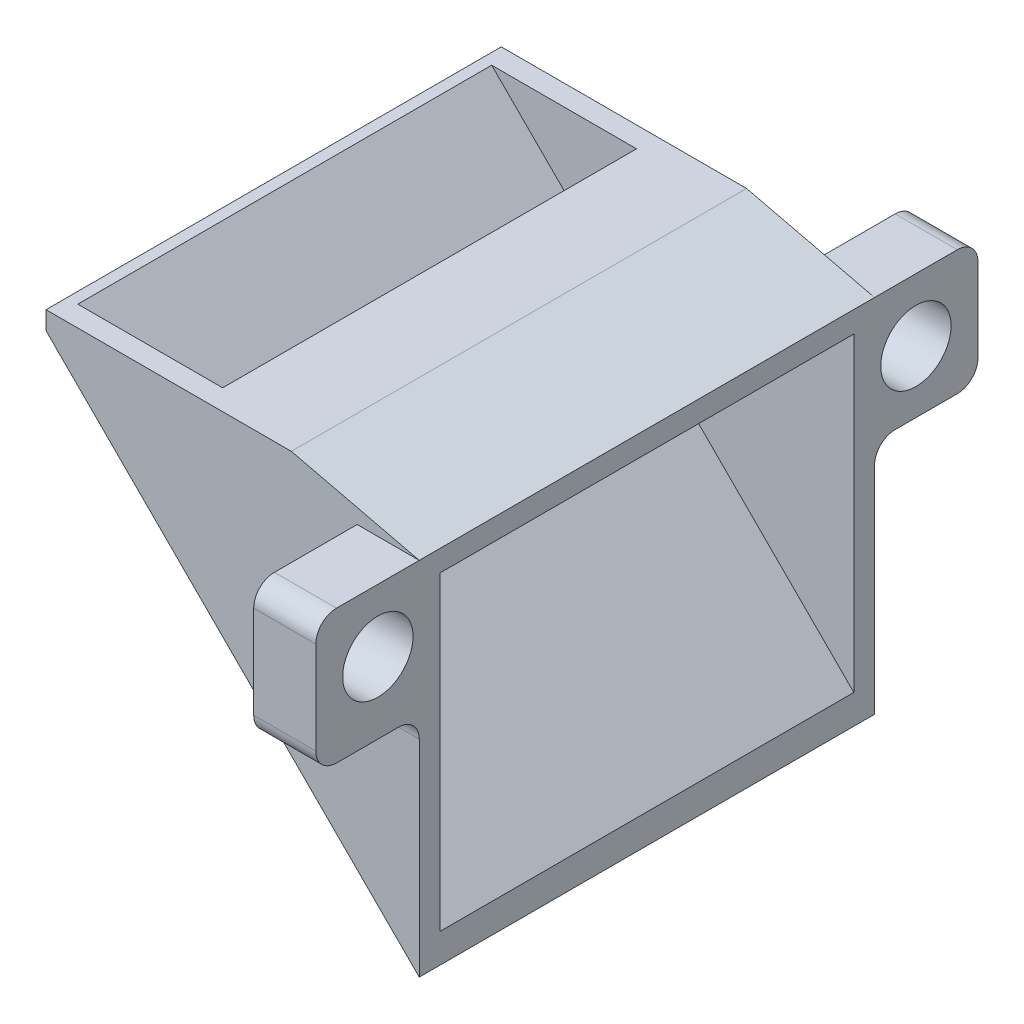
ISO-10303-21;
HEADER;
FILE_DESCRIPTION(('STEP AP214'),'2;1');
FILE_NAME('part.step','',(''),(''),'','','');
FILE_SCHEMA(('AUTOMOTIVE_DESIGN { 1 0 10303 214 1 1 1 1 }'));
ENDSEC;
DATA;
#1=APPLICATION_CONTEXT('core data for automotive mechanical design processes');
#2=APPLICATION_PROTOCOL_DEFINITION('international standard','automotive_design',2000,#1);
#3=PRODUCT_CONTEXT('',#1,'mechanical');
#4=PRODUCT('Part','Part','',(#3));
#5=PRODUCT_RELATED_PRODUCT_CATEGORY('part','',(#4));
#6=PRODUCT_DEFINITION_FORMATION('','',#4);
#7=PRODUCT_DEFINITION_CONTEXT('part definition',#1,'design');
#8=PRODUCT_DEFINITION('design','',#6,#7);
#9=PRODUCT_DEFINITION_SHAPE('','',#8);
#10=(LENGTH_UNIT() NAMED_UNIT(*) SI_UNIT(.MILLI.,.METRE.));
#11=(NAMED_UNIT(*) PLANE_ANGLE_UNIT() SI_UNIT($,.RADIAN.));
#12=(NAMED_UNIT(*) SI_UNIT($,.STERADIAN.) SOLID_ANGLE_UNIT());
#13=UNCERTAINTY_MEASURE_WITH_UNIT(LENGTH_MEASURE(1.E-05),#10,'distance_accuracy_value','');
#14=(GEOMETRIC_REPRESENTATION_CONTEXT(3) GLOBAL_UNCERTAINTY_ASSIGNED_CONTEXT((#13)) GLOBAL_UNIT_ASSIGNED_CONTEXT((#10,
#11,#12)) REPRESENTATION_CONTEXT('',''));
#15=CARTESIAN_POINT('',(0.,0.,0.));
#16=DIRECTION('',(0.,0.,1.));
#17=DIRECTION('',(1.,0.,0.));
#18=AXIS2_PLACEMENT_3D('',#15,#16,#17);
#19=CARTESIAN_POINT('',(0.,0.,-11.));
#20=DIRECTION('',(0.,0.,1.));
#21=DIRECTION('',(0.,-1.,0.));
#22=AXIS2_PLACEMENT_3D('',#19,#20,#21);
#23=PLANE('',#22);
#24=DIRECTION('',(-0.707106781186548,0.707106781186548,0.));
#25=VECTOR('',#24,1.);
#26=CARTESIAN_POINT('',(-4.45710678118655,-4.45710678118655,-11.));
#27=LINE('',#26,#25);
#28=CARTESIAN_POINT('',(10.,-18.9142135623731,-11.));
#29=VERTEX_POINT('',#28);
#30=CARTESIAN_POINT('',(-8.03645980155387,-0.877753760819228,-11.));
#31=VERTEX_POINT('',#30);
#32=EDGE_CURVE('E203',#29,#31,#27,.T.);
#33=ORIENTED_EDGE('',*,*,#32,.T.);
#34=DIRECTION('',(0.,-1.,0.));
#35=VECTOR('',#34,1.);
#36=CARTESIAN_POINT('',(-8.03645980155387,0.,-11.));
#37=LINE('',#36,#35);
#38=CARTESIAN_POINT('',(-8.03645980155387,0.,-11.));
#39=VERTEX_POINT('',#38);
#40=EDGE_CURVE('E56',#39,#31,#37,.T.);
#41=ORIENTED_EDGE('',*,*,#40,.F.);
#42=DIRECTION('',(-1.,0.,0.));
#43=VECTOR('',#42,1.);
#44=CARTESIAN_POINT('',(0.,0.,-11.));
#45=LINE('',#44,#43);
#46=CARTESIAN_POINT('',(3.81740662898458,0.,-11.));
#47=VERTEX_POINT('',#46);
#48=EDGE_CURVE('E199',#47,#39,#45,.T.);
#49=ORIENTED_EDGE('',*,*,#48,.F.);
#50=DIRECTION('',(-0.972806214685367,0.23162052730604,0.));
#51=VECTOR('',#50,1.);
#52=CARTESIAN_POINT('',(0.204796492971276,0.860145270479358,-11.));
#53=LINE('',#52,#51);
#54=CARTESIAN_POINT('',(10.,-1.47204604071795,-11.));
#55=VERTEX_POINT('',#54);
#56=EDGE_CURVE('E302',#55,#47,#53,.T.);
#57=ORIENTED_EDGE('',*,*,#56,.F.);
#58=DIRECTION('',(1.,0.,0.));
#59=VECTOR('',#58,1.);
#60=CARTESIAN_POINT('',(7.,-1.47204604071795,-11.));
#61=LINE('',#60,#59);
#62=CARTESIAN_POINT('',(7.,-1.47204604071795,-11.));
#63=VERTEX_POINT('',#62);
#64=EDGE_CURVE('E310',#63,#55,#61,.T.);
#65=ORIENTED_EDGE('',*,*,#64,.F.);
#66=DIRECTION('',(0.,-1.,0.));
#67=VECTOR('',#66,1.);
#68=CARTESIAN_POINT('',(7.,-1.47204604071795,-11.));
#69=LINE('',#68,#67);
#70=CARTESIAN_POINT('',(7.,-8.5,-11.));
#71=VERTEX_POINT('',#70);
#72=EDGE_CURVE('E313',#63,#71,#69,.T.);
#73=ORIENTED_EDGE('',*,*,#72,.T.);
#74=DIRECTION('',(1.,0.,0.));
#75=VECTOR('',#74,1.);
#76=CARTESIAN_POINT('',(0.,-8.5,-11.));
#77=LINE('',#76,#75);
#78=CARTESIAN_POINT('',(10.,-8.5,-11.));
#79=VERTEX_POINT('',#78);
#80=EDGE_CURVE('E434',#71,#79,#77,.T.);
#81=ORIENTED_EDGE('',*,*,#80,.T.);
#82=DIRECTION('',(0.,1.,0.));
#83=VECTOR('',#82,1.);
#84=CARTESIAN_POINT('',(10.,0.,-11.));
#85=LINE('',#84,#83);
#86=EDGE_CURVE('E222',#29,#79,#85,.T.);
#87=ORIENTED_EDGE('',*,*,#86,.F.);
#88=EDGE_LOOP('',(#33,#41,#49,#57,#65,#73,#81,#87));
#89=FACE_BOUND('',#88,.T.);
#90=ADVANCED_FACE('F41',(#89),#23,.F.);
#91=CARTESIAN_POINT('',(0.,0.,0.));
#92=DIRECTION('',(0.,-1.,0.));
#93=DIRECTION('',(0.,0.,-1.));
#94=AXIS2_PLACEMENT_3D('',#91,#92,#93);
#95=PLANE('',#94);
#96=ORIENTED_EDGE('',*,*,#48,.T.);
#97=DIRECTION('',(0.,0.,-1.));
#98=VECTOR('',#97,1.);
#99=CARTESIAN_POINT('',(-8.03645980155387,0.,16.));
#100=LINE('',#99,#98);
#101=CARTESIAN_POINT('',(-8.03645980155387,0.,11.));
#102=VERTEX_POINT('',#101);
#103=EDGE_CURVE('E188',#102,#39,#100,.T.);
#104=ORIENTED_EDGE('',*,*,#103,.F.);
#105=DIRECTION('',(1.,0.,0.));
#106=VECTOR('',#105,1.);
#107=CARTESIAN_POINT('',(0.,0.,11.));
#108=LINE('',#107,#106);
#109=CARTESIAN_POINT('',(3.81740662898458,0.,11.));
#110=VERTEX_POINT('',#109);
#111=EDGE_CURVE('E210',#102,#110,#108,.T.);
#112=ORIENTED_EDGE('',*,*,#111,.T.);
#113=DIRECTION('',(0.,0.,-1.));
#114=VECTOR('',#113,1.);
#115=CARTESIAN_POINT('',(3.81740662898458,0.,0.));
#116=LINE('',#115,#114);
#117=EDGE_CURVE('E209',#110,#47,#116,.T.);
#118=ORIENTED_EDGE('',*,*,#117,.T.);
#119=EDGE_LOOP('',(#96,#104,#112,#118));
#120=FACE_BOUND('',#119,.T.);
#121=DIRECTION('',(0.,0.,-1.));
#122=VECTOR('',#121,1.);
#123=CARTESIAN_POINT('',(-0.5,0.,10.));
#124=LINE('',#123,#122);
#125=CARTESIAN_POINT('',(-0.5,0.,10.));
#126=VERTEX_POINT('',#125);
#127=CARTESIAN_POINT('',(-0.5,0.,-10.));
#128=VERTEX_POINT('',#127);
#129=EDGE_CURVE('E275',#126,#128,#124,.T.);
#130=ORIENTED_EDGE('',*,*,#129,.F.);
#131=DIRECTION('',(1.,0.,0.));
#132=VECTOR('',#131,1.);
#133=CARTESIAN_POINT('',(-7.5,0.,10.));
#134=LINE('',#133,#132);
#135=CARTESIAN_POINT('',(-7.5,0.,10.));
#136=VERTEX_POINT('',#135);
#137=EDGE_CURVE('E225',#136,#126,#134,.T.);
#138=ORIENTED_EDGE('',*,*,#137,.F.);
#139=DIRECTION('',(0.,0.,1.));
#140=VECTOR('',#139,1.);
#141=CARTESIAN_POINT('',(-7.5,0.,10.));
#142=LINE('',#141,#140);
#143=CARTESIAN_POINT('',(-7.5,0.,-10.));
#144=VERTEX_POINT('',#143);
#145=EDGE_CURVE('E283',#144,#136,#142,.T.);
#146=ORIENTED_EDGE('',*,*,#145,.F.);
#147=DIRECTION('',(-1.,0.,0.));
#148=VECTOR('',#147,1.);
#149=CARTESIAN_POINT('',(-7.5,0.,-10.));
#150=LINE('',#149,#148);
#151=EDGE_CURVE('E277',#128,#144,#150,.T.);
#152=ORIENTED_EDGE('',*,*,#151,.F.);
#153=EDGE_LOOP('',(#130,#138,#146,#152));
#154=FACE_BOUND('',#153,.T.);
#155=ADVANCED_FACE('F206',(#120,#154),#95,.F.);
#156=CARTESIAN_POINT('',(10.,0.,0.));
#157=DIRECTION('',(-1.,0.,0.));
#158=DIRECTION('',(0.,0.,1.));
#159=AXIS2_PLACEMENT_3D('',#156,#157,#158);
#160=PLANE('',#159);
#161=CARTESIAN_POINT('',(10.,-4.5,-13.));
#162=DIRECTION('',(1.,0.,0.));
#163=DIRECTION('',(0.,0.,-1.));
#164=AXIS2_PLACEMENT_3D('',#161,#162,#163);
#165=CIRCLE('',#164,1.7);
#166=CARTESIAN_POINT('',(10.,-4.5,-14.7));
#167=VERTEX_POINT('',#166);
#168=EDGE_CURVE('E403',#167,#167,#165,.T.);
#169=ORIENTED_EDGE('',*,*,#168,.F.);
#170=EDGE_LOOP('',(#169));
#171=FACE_BOUND('',#170,.T.);
#172=CARTESIAN_POINT('',(10.,-4.5,13.));
#173=DIRECTION('',(1.,0.,0.));
#174=DIRECTION('',(0.,0.,-1.));
#175=AXIS2_PLACEMENT_3D('',#172,#173,#174);
#176=CIRCLE('',#175,1.7);
#177=CARTESIAN_POINT('',(10.,-4.5,11.3));
#178=VERTEX_POINT('',#177);
#179=EDGE_CURVE('E476',#178,#178,#176,.T.);
#180=ORIENTED_EDGE('',*,*,#179,.F.);
#181=EDGE_LOOP('',(#180));
#182=FACE_BOUND('',#181,.T.);
#183=DIRECTION('',(0.,-1.,0.));
#184=VECTOR('',#183,1.);
#185=CARTESIAN_POINT('',(10.,-1.47204604071796,16.));
#186=LINE('',#185,#184);
#187=CARTESIAN_POINT('',(10.,-2.47204604071796,16.));
#188=VERTEX_POINT('',#187);
#189=CARTESIAN_POINT('',(10.,-6.95279060676673,16.));
#190=VERTEX_POINT('',#189);
#191=EDGE_CURVE('E319',#188,#190,#186,.T.);
#192=ORIENTED_EDGE('',*,*,#191,.T.);
#193=CARTESIAN_POINT('',(10.,-6.95279060676673,15.));
#194=DIRECTION('',(-1.,0.,0.));
#195=DIRECTION('',(0.,0.,1.));
#196=AXIS2_PLACEMENT_3D('',#193,#194,#195);
#197=CIRCLE('',#196,1.);
#198=CARTESIAN_POINT('',(10.,-7.95279060676673,15.));
#199=VERTEX_POINT('',#198);
#200=EDGE_CURVE('E425',#190,#199,#197,.F.);
#201=ORIENTED_EDGE('',*,*,#200,.T.);
#202=DIRECTION('',(0.,0.,-1.));
#203=VECTOR('',#202,1.);
#204=CARTESIAN_POINT('',(10.,-7.95279060676673,11.));
#205=LINE('',#204,#203);
#206=CARTESIAN_POINT('',(10.,-7.95279060676673,12.));
#207=VERTEX_POINT('',#206);
#208=EDGE_CURVE('E331',#199,#207,#205,.T.);
#209=ORIENTED_EDGE('',*,*,#208,.T.);
#210=CARTESIAN_POINT('',(10.,-8.95279060676674,12.));
#211=DIRECTION('',(-1.,0.,0.));
#212=DIRECTION('',(0.,0.,1.));
#213=AXIS2_PLACEMENT_3D('',#210,#211,#212);
#214=CIRCLE('',#213,1.);
#215=CARTESIAN_POINT('',(10.,-8.95279060676674,11.));
#216=VERTEX_POINT('',#215);
#217=EDGE_CURVE('E451',#207,#216,#214,.T.);
#218=ORIENTED_EDGE('',*,*,#217,.T.);
#219=DIRECTION('',(0.,-1.,0.));
#220=VECTOR('',#219,1.);
#221=CARTESIAN_POINT('',(10.,0.,11.));
#222=LINE('',#221,#220);
#223=CARTESIAN_POINT('',(10.,-18.9142135623731,11.));
#224=VERTEX_POINT('',#223);
#225=EDGE_CURVE('E216',#216,#224,#222,.T.);
#226=ORIENTED_EDGE('',*,*,#225,.T.);
#227=DIRECTION('',(0.,0.,-1.));
#228=VECTOR('',#227,1.);
#229=CARTESIAN_POINT('',(10.,-18.9142135623731,0.));
#230=LINE('',#229,#228);
#231=EDGE_CURVE('E218',#224,#29,#230,.T.);
#232=ORIENTED_EDGE('',*,*,#231,.T.);
#233=ORIENTED_EDGE('',*,*,#86,.T.);
#234=CARTESIAN_POINT('',(10.,-8.5,-12.));
#235=DIRECTION('',(-1.,0.,0.));
#236=DIRECTION('',(0.,0.,1.));
#237=AXIS2_PLACEMENT_3D('',#234,#235,#236);
#238=CIRCLE('',#237,1.);
#239=CARTESIAN_POINT('',(10.,-7.5,-12.));
#240=VERTEX_POINT('',#239);
#241=EDGE_CURVE('E455',#79,#240,#238,.T.);
#242=ORIENTED_EDGE('',*,*,#241,.T.);
#243=DIRECTION('',(0.,0.,-1.));
#244=VECTOR('',#243,1.);
#245=CARTESIAN_POINT('',(10.,-7.5,-11.));
#246=LINE('',#245,#244);
#247=CARTESIAN_POINT('',(10.,-7.5,-15.));
#248=VERTEX_POINT('',#247);
#249=EDGE_CURVE('E406',#240,#248,#246,.T.);
#250=ORIENTED_EDGE('',*,*,#249,.T.);
#251=CARTESIAN_POINT('',(10.,-6.5,-15.));
#252=DIRECTION('',(-1.,0.,0.));
#253=DIRECTION('',(0.,0.,1.));
#254=AXIS2_PLACEMENT_3D('',#251,#252,#253);
#255=CIRCLE('',#254,1.);
#256=CARTESIAN_POINT('',(10.,-6.5,-16.));
#257=VERTEX_POINT('',#256);
#258=EDGE_CURVE('E421',#248,#257,#255,.F.);
#259=ORIENTED_EDGE('',*,*,#258,.T.);
#260=DIRECTION('',(0.,1.,0.));
#261=VECTOR('',#260,1.);
#262=CARTESIAN_POINT('',(10.,-1.47204604071795,-16.));
#263=LINE('',#262,#261);
#264=CARTESIAN_POINT('',(10.,-2.47204604071795,-16.));
#265=VERTEX_POINT('',#264);
#266=EDGE_CURVE('E487',#257,#265,#263,.T.);
#267=ORIENTED_EDGE('',*,*,#266,.T.);
#268=CARTESIAN_POINT('',(10.,-2.47204604071795,-15.));
#269=DIRECTION('',(-1.,0.,0.));
#270=DIRECTION('',(0.,0.,1.));
#271=AXIS2_PLACEMENT_3D('',#268,#269,#270);
#272=CIRCLE('',#271,1.);
#273=CARTESIAN_POINT('',(10.,-1.47204604071795,-15.));
#274=VERTEX_POINT('',#273);
#275=EDGE_CURVE('E419',#265,#274,#272,.F.);
#276=ORIENTED_EDGE('',*,*,#275,.T.);
#277=DIRECTION('',(0.,0.,1.));
#278=VECTOR('',#277,1.);
#279=CARTESIAN_POINT('',(10.,-1.47204604071795,-11.));
#280=LINE('',#279,#278);
#281=EDGE_CURVE('E325',#274,#55,#280,.T.);
#282=ORIENTED_EDGE('',*,*,#281,.T.);
#283=DIRECTION('',(0.,0.,1.));
#284=VECTOR('',#283,1.);
#285=CARTESIAN_POINT('',(10.,-1.47204604071796,0.));
#286=LINE('',#285,#284);
#287=CARTESIAN_POINT('',(10.,-1.47204604071796,11.));
#288=VERTEX_POINT('',#287);
#289=EDGE_CURVE('E219',#55,#288,#286,.T.);
#290=ORIENTED_EDGE('',*,*,#289,.T.);
#291=DIRECTION('',(0.,0.,1.));
#292=VECTOR('',#291,1.);
#293=CARTESIAN_POINT('',(10.,-1.47204604071796,11.));
#294=LINE('',#293,#292);
#295=CARTESIAN_POINT('',(10.,-1.47204604071796,15.));
#296=VERTEX_POINT('',#295);
#297=EDGE_CURVE('E315',#288,#296,#294,.T.);
#298=ORIENTED_EDGE('',*,*,#297,.T.);
#299=CARTESIAN_POINT('',(10.,-2.47204604071796,15.));
#300=DIRECTION('',(-1.,0.,0.));
#301=DIRECTION('',(0.,0.,1.));
#302=AXIS2_PLACEMENT_3D('',#299,#300,#301);
#303=CIRCLE('',#302,1.);
#304=EDGE_CURVE('E423',#296,#188,#303,.F.);
#305=ORIENTED_EDGE('',*,*,#304,.T.);
#306=EDGE_LOOP('',(#192,#201,#209,#218,#226,#232,#233,#242,#250,#259,#267,#276,#282,#290,#298,#305));
#307=FACE_BOUND('',#306,.T.);
#308=DIRECTION('',(0.,1.,0.));
#309=VECTOR('',#308,1.);
#310=CARTESIAN_POINT('',(10.,-17.5,-10.));
#311=LINE('',#310,#309);
#312=CARTESIAN_POINT('',(10.,-17.5,-10.));
#313=VERTEX_POINT('',#312);
#314=CARTESIAN_POINT('',(10.,-2.5,-10.));
#315=VERTEX_POINT('',#314);
#316=EDGE_CURVE('E347',#313,#315,#311,.T.);
#317=ORIENTED_EDGE('',*,*,#316,.F.);
#318=DIRECTION('',(0.,0.,-1.));
#319=VECTOR('',#318,1.);
#320=CARTESIAN_POINT('',(10.,-17.5,10.));
#321=LINE('',#320,#319);
#322=CARTESIAN_POINT('',(10.,-17.5,10.));
#323=VERTEX_POINT('',#322);
#324=EDGE_CURVE('E233',#323,#313,#321,.T.);
#325=ORIENTED_EDGE('',*,*,#324,.F.);
#326=DIRECTION('',(0.,-1.,0.));
#327=VECTOR('',#326,1.);
#328=CARTESIAN_POINT('',(10.,-17.5,10.));
#329=LINE('',#328,#327);
#330=CARTESIAN_POINT('',(10.,-2.5,10.));
#331=VERTEX_POINT('',#330);
#332=EDGE_CURVE('E387',#331,#323,#329,.T.);
#333=ORIENTED_EDGE('',*,*,#332,.F.);
#334=DIRECTION('',(0.,0.,1.));
#335=VECTOR('',#334,1.);
#336=CARTESIAN_POINT('',(10.,-2.5,10.));
#337=LINE('',#336,#335);
#338=EDGE_CURVE('E392',#315,#331,#337,.T.);
#339=ORIENTED_EDGE('',*,*,#338,.F.);
#340=EDGE_LOOP('',(#317,#325,#333,#339));
#341=FACE_BOUND('',#340,.T.);
#342=ADVANCED_FACE('F240',(#171,#182,#307,#341),#160,.F.);
#343=CARTESIAN_POINT('',(0.,0.,11.));
#344=DIRECTION('',(0.,0.,1.));
#345=DIRECTION('',(1.,0.,0.));
#346=AXIS2_PLACEMENT_3D('',#343,#344,#345);
#347=PLANE('',#346);
#348=DIRECTION('',(0.,1.,0.));
#349=VECTOR('',#348,1.);
#350=CARTESIAN_POINT('',(-8.03645980155387,0.,11.));
#351=LINE('',#350,#349);
#352=CARTESIAN_POINT('',(-8.03645980155387,-0.877753760819234,11.));
#353=VERTEX_POINT('',#352);
#354=EDGE_CURVE('E191',#353,#102,#351,.T.);
#355=ORIENTED_EDGE('',*,*,#354,.F.);
#356=DIRECTION('',(-0.707106781186548,0.707106781186548,0.));
#357=VECTOR('',#356,1.);
#358=CARTESIAN_POINT('',(-4.45710678118655,-4.45710678118655,11.));
#359=LINE('',#358,#357);
#360=EDGE_CURVE('E299',#224,#353,#359,.T.);
#361=ORIENTED_EDGE('',*,*,#360,.F.);
#362=ORIENTED_EDGE('',*,*,#225,.F.);
#363=DIRECTION('',(1.,0.,0.));
#364=VECTOR('',#363,1.);
#365=CARTESIAN_POINT('',(7.,-8.95279060676674,11.));
#366=LINE('',#365,#364);
#367=CARTESIAN_POINT('',(7.,-8.95279060676674,11.));
#368=VERTEX_POINT('',#367);
#369=EDGE_CURVE('E411',#216,#368,#366,.F.);
#370=ORIENTED_EDGE('',*,*,#369,.T.);
#371=DIRECTION('',(0.,1.,0.));
#372=VECTOR('',#371,1.);
#373=CARTESIAN_POINT('',(7.,-1.47204604071796,11.));
#374=LINE('',#373,#372);
#375=CARTESIAN_POINT('',(7.,-1.47204604071796,11.));
#376=VERTEX_POINT('',#375);
#377=EDGE_CURVE('E327',#368,#376,#374,.T.);
#378=ORIENTED_EDGE('',*,*,#377,.T.);
#379=DIRECTION('',(1.,0.,0.));
#380=VECTOR('',#379,1.);
#381=CARTESIAN_POINT('',(7.,-1.47204604071796,11.));
#382=LINE('',#381,#380);
#383=EDGE_CURVE('E339',#376,#288,#382,.T.);
#384=ORIENTED_EDGE('',*,*,#383,.T.);
#385=DIRECTION('',(-0.972806214685367,0.23162052730604,0.));
#386=VECTOR('',#385,1.);
#387=CARTESIAN_POINT('',(0.204796492971274,0.860145270479359,11.));
#388=LINE('',#387,#386);
#389=EDGE_CURVE('E221',#288,#110,#388,.T.);
#390=ORIENTED_EDGE('',*,*,#389,.T.);
#391=ORIENTED_EDGE('',*,*,#111,.F.);
#392=EDGE_LOOP('',(#355,#361,#362,#370,#378,#384,#390,#391));
#393=FACE_BOUND('',#392,.T.);
#394=ADVANCED_FACE('F250',(#393),#347,.T.);
#395=CARTESIAN_POINT('',(-4.45710678118655,-4.45710678118655,0.));
#396=DIRECTION('',(0.707106781186548,0.707106781186548,0.));
#397=DIRECTION('',(-0.707106781186548,0.707106781186548,0.));
#398=AXIS2_PLACEMENT_3D('',#395,#396,#397);
#399=PLANE('',#398);
#400=ORIENTED_EDGE('',*,*,#360,.T.);
#401=DIRECTION('',(0.,0.,-1.));
#402=VECTOR('',#401,1.);
#403=CARTESIAN_POINT('',(-8.03645980155387,-0.877753760819229,0.));
#404=LINE('',#403,#402);
#405=EDGE_CURVE('E12',#353,#31,#404,.T.);
#406=ORIENTED_EDGE('',*,*,#405,.T.);
#407=ORIENTED_EDGE('',*,*,#32,.F.);
#408=ORIENTED_EDGE('',*,*,#231,.F.);
#409=EDGE_LOOP('',(#400,#406,#407,#408));
#410=FACE_BOUND('',#409,.T.);
#411=ADVANCED_FACE('F474',(#410),#399,.F.);
#412=CARTESIAN_POINT('',(0.204796492971276,0.860145270479358,0.));
#413=DIRECTION('',(-0.23162052730604,-0.972806214685367,0.));
#414=DIRECTION('',(0.972806214685367,-0.23162052730604,0.));
#415=AXIS2_PLACEMENT_3D('',#412,#413,#414);
#416=PLANE('',#415);
#417=ORIENTED_EDGE('',*,*,#56,.T.);
#418=ORIENTED_EDGE('',*,*,#117,.F.);
#419=ORIENTED_EDGE('',*,*,#389,.F.);
#420=ORIENTED_EDGE('',*,*,#289,.F.);
#421=EDGE_LOOP('',(#417,#418,#419,#420));
#422=FACE_BOUND('',#421,.T.);
#423=ADVANCED_FACE('F306',(#422),#416,.F.);
#424=CARTESIAN_POINT('',(0.,0.,10.));
#425=DIRECTION('',(0.,0.,1.));
#426=DIRECTION('',(1.,0.,0.));
#427=AXIS2_PLACEMENT_3D('',#424,#425,#426);
#428=PLANE('',#427);
#429=DIRECTION('',(-0.972806214685367,0.23162052730604,0.));
#430=VECTOR('',#429,1.);
#431=CARTESIAN_POINT('',(10.,-2.5,10.));
#432=LINE('',#431,#430);
#433=EDGE_CURVE('E386',#331,#126,#432,.T.);
#434=ORIENTED_EDGE('',*,*,#433,.F.);
#435=ORIENTED_EDGE('',*,*,#332,.T.);
#436=DIRECTION('',(-0.707106781186548,0.707106781186548,0.));
#437=VECTOR('',#436,1.);
#438=CARTESIAN_POINT('',(10.,-17.5,10.));
#439=LINE('',#438,#437);
#440=EDGE_CURVE('E356',#323,#136,#439,.T.);
#441=ORIENTED_EDGE('',*,*,#440,.T.);
#442=ORIENTED_EDGE('',*,*,#137,.T.);
#443=EDGE_LOOP('',(#434,#435,#441,#442));
#444=FACE_BOUND('',#443,.T.);
#445=ADVANCED_FACE('F368',(#444),#428,.F.);
#446=CARTESIAN_POINT('',(-3.75,-3.75,0.));
#447=DIRECTION('',(0.707106781186548,0.707106781186548,0.));
#448=DIRECTION('',(-0.707106781186548,0.707106781186548,0.));
#449=AXIS2_PLACEMENT_3D('',#446,#447,#448);
#450=PLANE('',#449);
#451=ORIENTED_EDGE('',*,*,#440,.F.);
#452=ORIENTED_EDGE('',*,*,#324,.T.);
#453=DIRECTION('',(-0.707106781186548,0.707106781186548,0.));
#454=VECTOR('',#453,1.);
#455=CARTESIAN_POINT('',(10.,-17.5,-10.));
#456=LINE('',#455,#454);
#457=EDGE_CURVE('E281',#313,#144,#456,.T.);
#458=ORIENTED_EDGE('',*,*,#457,.T.);
#459=ORIENTED_EDGE('',*,*,#145,.T.);
#460=EDGE_LOOP('',(#451,#452,#458,#459));
#461=FACE_BOUND('',#460,.T.);
#462=ADVANCED_FACE('F358',(#461),#450,.T.);
#463=CARTESIAN_POINT('',(-0.026824034334764,-0.112660944206009,0.));
#464=DIRECTION('',(-0.23162052730604,-0.972806214685367,0.));
#465=DIRECTION('',(0.972806214685367,-0.23162052730604,0.));
#466=AXIS2_PLACEMENT_3D('',#463,#464,#465);
#467=PLANE('',#466);
#468=DIRECTION('',(-0.972806214685367,0.23162052730604,0.));
#469=VECTOR('',#468,1.);
#470=CARTESIAN_POINT('',(10.,-2.5,-10.));
#471=LINE('',#470,#469);
#472=EDGE_CURVE('E285',#315,#128,#471,.T.);
#473=ORIENTED_EDGE('',*,*,#472,.F.);
#474=ORIENTED_EDGE('',*,*,#338,.T.);
#475=ORIENTED_EDGE('',*,*,#433,.T.);
#476=ORIENTED_EDGE('',*,*,#129,.T.);
#477=EDGE_LOOP('',(#473,#474,#475,#476));
#478=FACE_BOUND('',#477,.T.);
#479=ADVANCED_FACE('F367',(#478),#467,.T.);
#480=CARTESIAN_POINT('',(0.,0.,-10.));
#481=DIRECTION('',(0.,0.,1.));
#482=DIRECTION('',(0.,-1.,0.));
#483=AXIS2_PLACEMENT_3D('',#480,#481,#482);
#484=PLANE('',#483);
#485=ORIENTED_EDGE('',*,*,#457,.F.);
#486=ORIENTED_EDGE('',*,*,#316,.T.);
#487=ORIENTED_EDGE('',*,*,#472,.T.);
#488=ORIENTED_EDGE('',*,*,#151,.T.);
#489=EDGE_LOOP('',(#485,#486,#487,#488));
#490=FACE_BOUND('',#489,.T.);
#491=ADVANCED_FACE('F252',(#490),#484,.T.);
#492=CARTESIAN_POINT('',(7.,-7.95279060676673,11.));
#493=DIRECTION('',(0.,-1.,0.));
#494=DIRECTION('',(0.,0.,-1.));
#495=AXIS2_PLACEMENT_3D('',#492,#493,#494);
#496=PLANE('',#495);
#497=DIRECTION('',(0.,0.,-1.));
#498=VECTOR('',#497,1.);
#499=CARTESIAN_POINT('',(7.,-7.95279060676673,11.));
#500=LINE('',#499,#498);
#501=CARTESIAN_POINT('',(7.,-7.95279060676673,15.));
#502=VERTEX_POINT('',#501);
#503=CARTESIAN_POINT('',(7.,-7.95279060676673,12.));
#504=VERTEX_POINT('',#503);
#505=EDGE_CURVE('E337',#502,#504,#500,.T.);
#506=ORIENTED_EDGE('',*,*,#505,.T.);
#507=DIRECTION('',(1.,0.,0.));
#508=VECTOR('',#507,1.);
#509=CARTESIAN_POINT('',(10.,-7.95279060676673,12.));
#510=LINE('',#509,#508);
#511=EDGE_CURVE('E408',#504,#207,#510,.T.);
#512=ORIENTED_EDGE('',*,*,#511,.T.);
#513=ORIENTED_EDGE('',*,*,#208,.F.);
#514=DIRECTION('',(1.,0.,0.));
#515=VECTOR('',#514,1.);
#516=CARTESIAN_POINT('',(7.,-7.95279060676673,15.));
#517=LINE('',#516,#515);
#518=EDGE_CURVE('E212',#199,#502,#517,.F.);
#519=ORIENTED_EDGE('',*,*,#518,.T.);
#520=EDGE_LOOP('',(#506,#512,#513,#519));
#521=FACE_BOUND('',#520,.T.);
#522=ADVANCED_FACE('F566',(#521),#496,.T.);
#523=CARTESIAN_POINT('',(7.,-1.47204604071796,16.));
#524=DIRECTION('',(0.,0.,1.));
#525=DIRECTION('',(0.,-1.,0.));
#526=AXIS2_PLACEMENT_3D('',#523,#524,#525);
#527=PLANE('',#526);
#528=DIRECTION('',(0.,-1.,0.));
#529=VECTOR('',#528,1.);
#530=CARTESIAN_POINT('',(7.,-1.47204604071796,16.));
#531=LINE('',#530,#529);
#532=CARTESIAN_POINT('',(7.,-2.47204604071796,16.));
#533=VERTEX_POINT('',#532);
#534=CARTESIAN_POINT('',(7.,-6.95279060676673,16.));
#535=VERTEX_POINT('',#534);
#536=EDGE_CURVE('E334',#533,#535,#531,.T.);
#537=ORIENTED_EDGE('',*,*,#536,.T.);
#538=DIRECTION('',(1.,0.,0.));
#539=VECTOR('',#538,1.);
#540=CARTESIAN_POINT('',(7.,-6.95279060676673,16.));
#541=LINE('',#540,#539);
#542=EDGE_CURVE('E416',#535,#190,#541,.T.);
#543=ORIENTED_EDGE('',*,*,#542,.T.);
#544=ORIENTED_EDGE('',*,*,#191,.F.);
#545=DIRECTION('',(1.,0.,0.));
#546=VECTOR('',#545,1.);
#547=CARTESIAN_POINT('',(7.,-2.47204604071796,16.));
#548=LINE('',#547,#546);
#549=EDGE_CURVE('E414',#188,#533,#548,.F.);
#550=ORIENTED_EDGE('',*,*,#549,.T.);
#551=EDGE_LOOP('',(#537,#543,#544,#550));
#552=FACE_BOUND('',#551,.T.);
#553=ADVANCED_FACE('F561',(#552),#527,.T.);
#554=CARTESIAN_POINT('',(7.,-1.47204604071796,11.));
#555=DIRECTION('',(0.,1.,0.));
#556=DIRECTION('',(0.,0.,1.));
#557=AXIS2_PLACEMENT_3D('',#554,#555,#556);
#558=PLANE('',#557);
#559=DIRECTION('',(0.,0.,1.));
#560=VECTOR('',#559,1.);
#561=CARTESIAN_POINT('',(7.,-1.47204604071796,11.));
#562=LINE('',#561,#560);
#563=CARTESIAN_POINT('',(7.,-1.47204604071796,15.));
#564=VERTEX_POINT('',#563);
#565=EDGE_CURVE('E330',#376,#564,#562,.T.);
#566=ORIENTED_EDGE('',*,*,#565,.T.);
#567=DIRECTION('',(1.,0.,0.));
#568=VECTOR('',#567,1.);
#569=CARTESIAN_POINT('',(7.,-1.47204604071796,15.));
#570=LINE('',#569,#568);
#571=EDGE_CURVE('E431',#564,#296,#570,.T.);
#572=ORIENTED_EDGE('',*,*,#571,.T.);
#573=ORIENTED_EDGE('',*,*,#297,.F.);
#574=ORIENTED_EDGE('',*,*,#383,.F.);
#575=EDGE_LOOP('',(#566,#572,#573,#574));
#576=FACE_BOUND('',#575,.T.);
#577=ADVANCED_FACE('F556',(#576),#558,.T.);
#578=CARTESIAN_POINT('',(7.,0.,0.));
#579=DIRECTION('',(-1.,0.,0.));
#580=DIRECTION('',(0.,0.,1.));
#581=AXIS2_PLACEMENT_3D('',#578,#579,#580);
#582=PLANE('',#581);
#583=CARTESIAN_POINT('',(7.,-4.5,13.));
#584=DIRECTION('',(-1.,0.,0.));
#585=DIRECTION('',(0.,0.,1.));
#586=AXIS2_PLACEMENT_3D('',#583,#584,#585);
#587=CIRCLE('',#586,1.7);
#588=CARTESIAN_POINT('',(7.,-4.5,14.7));
#589=VERTEX_POINT('',#588);
#590=EDGE_CURVE('E402',#589,#589,#587,.T.);
#591=ORIENTED_EDGE('',*,*,#590,.F.);
#592=EDGE_LOOP('',(#591));
#593=FACE_BOUND('',#592,.T.);
#594=ORIENTED_EDGE('',*,*,#505,.F.);
#595=CARTESIAN_POINT('',(7.,-6.95279060676673,15.));
#596=DIRECTION('',(-1.,0.,0.));
#597=DIRECTION('',(0.,0.,1.));
#598=AXIS2_PLACEMENT_3D('',#595,#596,#597);
#599=CIRCLE('',#598,1.);
#600=EDGE_CURVE('E429',#502,#535,#599,.T.);
#601=ORIENTED_EDGE('',*,*,#600,.T.);
#602=ORIENTED_EDGE('',*,*,#536,.F.);
#603=CARTESIAN_POINT('',(7.,-2.47204604071796,15.));
#604=DIRECTION('',(-1.,0.,0.));
#605=DIRECTION('',(0.,0.,1.));
#606=AXIS2_PLACEMENT_3D('',#603,#604,#605);
#607=CIRCLE('',#606,1.);
#608=EDGE_CURVE('E427',#533,#564,#607,.T.);
#609=ORIENTED_EDGE('',*,*,#608,.T.);
#610=ORIENTED_EDGE('',*,*,#565,.F.);
#611=ORIENTED_EDGE('',*,*,#377,.F.);
#612=CARTESIAN_POINT('',(7.,-8.95279060676674,12.));
#613=DIRECTION('',(-1.,0.,0.));
#614=DIRECTION('',(0.,0.,1.));
#615=AXIS2_PLACEMENT_3D('',#612,#613,#614);
#616=CIRCLE('',#615,1.);
#617=EDGE_CURVE('E453',#368,#504,#616,.F.);
#618=ORIENTED_EDGE('',*,*,#617,.T.);
#619=EDGE_LOOP('',(#594,#601,#602,#609,#610,#611,#618));
#620=FACE_BOUND('',#619,.T.);
#621=ADVANCED_FACE('F552',(#593,#620),#582,.T.);
#622=CARTESIAN_POINT('',(7.,-1.47204604071795,-11.));
#623=DIRECTION('',(0.,1.,0.));
#624=DIRECTION('',(0.,0.,1.));
#625=AXIS2_PLACEMENT_3D('',#622,#623,#624);
#626=PLANE('',#625);
#627=ORIENTED_EDGE('',*,*,#281,.F.);
#628=DIRECTION('',(1.,0.,0.));
#629=VECTOR('',#628,1.);
#630=CARTESIAN_POINT('',(7.,-1.47204604071795,-15.));
#631=LINE('',#630,#629);
#632=CARTESIAN_POINT('',(7.,-1.47204604071795,-15.));
#633=VERTEX_POINT('',#632);
#634=EDGE_CURVE('E63',#274,#633,#631,.F.);
#635=ORIENTED_EDGE('',*,*,#634,.T.);
#636=DIRECTION('',(0.,0.,1.));
#637=VECTOR('',#636,1.);
#638=CARTESIAN_POINT('',(7.,-1.47204604071795,-11.));
#639=LINE('',#638,#637);
#640=EDGE_CURVE('E316',#633,#63,#639,.T.);
#641=ORIENTED_EDGE('',*,*,#640,.T.);
#642=ORIENTED_EDGE('',*,*,#64,.T.);
#643=EDGE_LOOP('',(#627,#635,#641,#642));
#644=FACE_BOUND('',#643,.T.);
#645=ADVANCED_FACE('F490',(#644),#626,.T.);
#646=CARTESIAN_POINT('',(7.,-1.47204604071795,-16.));
#647=DIRECTION('',(0.,0.,-1.));
#648=DIRECTION('',(-1.,0.,0.));
#649=AXIS2_PLACEMENT_3D('',#646,#647,#648);
#650=PLANE('',#649);
#651=ORIENTED_EDGE('',*,*,#266,.F.);
#652=DIRECTION('',(1.,0.,0.));
#653=VECTOR('',#652,1.);
#654=CARTESIAN_POINT('',(7.,-6.5,-16.));
#655=LINE('',#654,#653);
#656=CARTESIAN_POINT('',(7.,-6.5,-16.));
#657=VERTEX_POINT('',#656);
#658=EDGE_CURVE('E444',#257,#657,#655,.F.);
#659=ORIENTED_EDGE('',*,*,#658,.T.);
#660=DIRECTION('',(0.,1.,0.));
#661=VECTOR('',#660,1.);
#662=CARTESIAN_POINT('',(7.,-1.47204604071795,-16.));
#663=LINE('',#662,#661);
#664=CARTESIAN_POINT('',(7.,-2.47204604071795,-16.));
#665=VERTEX_POINT('',#664);
#666=EDGE_CURVE('E321',#657,#665,#663,.T.);
#667=ORIENTED_EDGE('',*,*,#666,.T.);
#668=DIRECTION('',(1.,0.,0.));
#669=VECTOR('',#668,1.);
#670=CARTESIAN_POINT('',(7.,-2.47204604071795,-16.));
#671=LINE('',#670,#669);
#672=EDGE_CURVE('E441',#665,#265,#671,.T.);
#673=ORIENTED_EDGE('',*,*,#672,.T.);
#674=EDGE_LOOP('',(#651,#659,#667,#673));
#675=FACE_BOUND('',#674,.T.);
#676=ADVANCED_FACE('F496',(#675),#650,.T.);
#677=CARTESIAN_POINT('',(7.,-7.5,-11.));
#678=DIRECTION('',(0.,-1.,0.));
#679=DIRECTION('',(0.,0.,-1.));
#680=AXIS2_PLACEMENT_3D('',#677,#678,#679);
#681=PLANE('',#680);
#682=ORIENTED_EDGE('',*,*,#249,.F.);
#683=DIRECTION('',(1.,0.,0.));
#684=VECTOR('',#683,1.);
#685=CARTESIAN_POINT('',(7.,-7.5,-12.));
#686=LINE('',#685,#684);
#687=CARTESIAN_POINT('',(7.,-7.5,-12.));
#688=VERTEX_POINT('',#687);
#689=EDGE_CURVE('E439',#240,#688,#686,.F.);
#690=ORIENTED_EDGE('',*,*,#689,.T.);
#691=DIRECTION('',(0.,0.,-1.));
#692=VECTOR('',#691,1.);
#693=CARTESIAN_POINT('',(7.,-7.5,-11.));
#694=LINE('',#693,#692);
#695=CARTESIAN_POINT('',(7.,-7.5,-15.));
#696=VERTEX_POINT('',#695);
#697=EDGE_CURVE('E463',#688,#696,#694,.T.);
#698=ORIENTED_EDGE('',*,*,#697,.T.);
#699=DIRECTION('',(1.,0.,0.));
#700=VECTOR('',#699,1.);
#701=CARTESIAN_POINT('',(7.,-7.5,-15.));
#702=LINE('',#701,#700);
#703=EDGE_CURVE('E436',#696,#248,#702,.T.);
#704=ORIENTED_EDGE('',*,*,#703,.T.);
#705=EDGE_LOOP('',(#682,#690,#698,#704));
#706=FACE_BOUND('',#705,.T.);
#707=ADVANCED_FACE('F502',(#706),#681,.T.);
#708=CARTESIAN_POINT('',(7.,0.,0.));
#709=DIRECTION('',(1.,0.,0.));
#710=DIRECTION('',(0.,0.,-1.));
#711=AXIS2_PLACEMENT_3D('',#708,#709,#710);
#712=PLANE('',#711);
#713=CARTESIAN_POINT('',(7.,-4.5,-13.));
#714=DIRECTION('',(1.,0.,0.));
#715=DIRECTION('',(0.,0.,-1.));
#716=AXIS2_PLACEMENT_3D('',#713,#714,#715);
#717=CIRCLE('',#716,1.7);
#718=CARTESIAN_POINT('',(7.,-4.5,-14.7));
#719=VERTEX_POINT('',#718);
#720=EDGE_CURVE('E399',#719,#719,#717,.T.);
#721=ORIENTED_EDGE('',*,*,#720,.T.);
#722=EDGE_LOOP('',(#721));
#723=FACE_BOUND('',#722,.T.);
#724=ORIENTED_EDGE('',*,*,#666,.F.);
#725=CARTESIAN_POINT('',(7.,-6.5,-15.));
#726=DIRECTION('',(1.,0.,0.));
#727=DIRECTION('',(0.,0.,-1.));
#728=AXIS2_PLACEMENT_3D('',#725,#726,#727);
#729=CIRCLE('',#728,1.);
#730=EDGE_CURVE('E448',#657,#696,#729,.F.);
#731=ORIENTED_EDGE('',*,*,#730,.T.);
#732=ORIENTED_EDGE('',*,*,#697,.F.);
#733=CARTESIAN_POINT('',(7.,-8.5,-12.));
#734=DIRECTION('',(1.,0.,0.));
#735=DIRECTION('',(0.,0.,-1.));
#736=AXIS2_PLACEMENT_3D('',#733,#734,#735);
#737=CIRCLE('',#736,1.);
#738=EDGE_CURVE('E49',#688,#71,#737,.T.);
#739=ORIENTED_EDGE('',*,*,#738,.T.);
#740=ORIENTED_EDGE('',*,*,#72,.F.);
#741=ORIENTED_EDGE('',*,*,#640,.F.);
#742=CARTESIAN_POINT('',(7.,-2.47204604071795,-15.));
#743=DIRECTION('',(1.,0.,0.));
#744=DIRECTION('',(0.,0.,-1.));
#745=AXIS2_PLACEMENT_3D('',#742,#743,#744);
#746=CIRCLE('',#745,1.);
#747=EDGE_CURVE('E446',#633,#665,#746,.F.);
#748=ORIENTED_EDGE('',*,*,#747,.T.);
#749=EDGE_LOOP('',(#724,#731,#732,#739,#740,#741,#748));
#750=FACE_BOUND('',#749,.T.);
#751=ADVANCED_FACE('F461',(#723,#750),#712,.F.);
#752=CARTESIAN_POINT('',(0.,-4.5,-13.));
#753=DIRECTION('',(1.,0.,0.));
#754=DIRECTION('',(0.,0.,-1.));
#755=AXIS2_PLACEMENT_3D('',#752,#753,#754);
#756=CYLINDRICAL_SURFACE('',#755,1.7);
#757=ORIENTED_EDGE('',*,*,#168,.T.);
#758=EDGE_LOOP('',(#757));
#759=FACE_BOUND('',#758,.T.);
#760=ORIENTED_EDGE('',*,*,#720,.F.);
#761=EDGE_LOOP('',(#760));
#762=FACE_BOUND('',#761,.T.);
#763=ADVANCED_FACE('F509',(#759,#762),#756,.F.);
#764=CARTESIAN_POINT('',(0.,-4.5,13.));
#765=DIRECTION('',(1.,0.,0.));
#766=DIRECTION('',(0.,0.,-1.));
#767=AXIS2_PLACEMENT_3D('',#764,#765,#766);
#768=CYLINDRICAL_SURFACE('',#767,1.7);
#769=ORIENTED_EDGE('',*,*,#590,.T.);
#770=EDGE_LOOP('',(#769));
#771=FACE_BOUND('',#770,.T.);
#772=ORIENTED_EDGE('',*,*,#179,.T.);
#773=EDGE_LOOP('',(#772));
#774=FACE_BOUND('',#773,.T.);
#775=ADVANCED_FACE('F525',(#771,#774),#768,.F.);
#776=CARTESIAN_POINT('',(7.,-8.95279060676674,12.));
#777=DIRECTION('',(-1.,0.,0.));
#778=DIRECTION('',(0.,0.,1.));
#779=AXIS2_PLACEMENT_3D('',#776,#777,#778);
#780=CYLINDRICAL_SURFACE('',#779,1.);
#781=ORIENTED_EDGE('',*,*,#617,.F.);
#782=ORIENTED_EDGE('',*,*,#369,.F.);
#783=ORIENTED_EDGE('',*,*,#217,.F.);
#784=ORIENTED_EDGE('',*,*,#511,.F.);
#785=EDGE_LOOP('',(#781,#782,#783,#784));
#786=FACE_BOUND('',#785,.T.);
#787=ADVANCED_FACE('F521',(#786),#780,.F.);
#788=CARTESIAN_POINT('',(7.,-6.95279060676673,15.));
#789=DIRECTION('',(1.,0.,0.));
#790=DIRECTION('',(0.,0.,-1.));
#791=AXIS2_PLACEMENT_3D('',#788,#789,#790);
#792=CYLINDRICAL_SURFACE('',#791,1.);
#793=ORIENTED_EDGE('',*,*,#600,.F.);
#794=ORIENTED_EDGE('',*,*,#518,.F.);
#795=ORIENTED_EDGE('',*,*,#200,.F.);
#796=ORIENTED_EDGE('',*,*,#542,.F.);
#797=EDGE_LOOP('',(#793,#794,#795,#796));
#798=FACE_BOUND('',#797,.T.);
#799=ADVANCED_FACE('F524',(#798),#792,.T.);
#800=CARTESIAN_POINT('',(7.,-2.47204604071796,15.));
#801=DIRECTION('',(1.,0.,0.));
#802=DIRECTION('',(0.,0.,-1.));
#803=AXIS2_PLACEMENT_3D('',#800,#801,#802);
#804=CYLINDRICAL_SURFACE('',#803,1.);
#805=ORIENTED_EDGE('',*,*,#608,.F.);
#806=ORIENTED_EDGE('',*,*,#549,.F.);
#807=ORIENTED_EDGE('',*,*,#304,.F.);
#808=ORIENTED_EDGE('',*,*,#571,.F.);
#809=EDGE_LOOP('',(#805,#806,#807,#808));
#810=FACE_BOUND('',#809,.T.);
#811=ADVANCED_FACE('F529',(#810),#804,.T.);
#812=CARTESIAN_POINT('',(0.,-8.5,-12.));
#813=DIRECTION('',(1.,0.,0.));
#814=DIRECTION('',(0.,0.,-1.));
#815=AXIS2_PLACEMENT_3D('',#812,#813,#814);
#816=CYLINDRICAL_SURFACE('',#815,1.);
#817=ORIENTED_EDGE('',*,*,#738,.F.);
#818=ORIENTED_EDGE('',*,*,#689,.F.);
#819=ORIENTED_EDGE('',*,*,#241,.F.);
#820=ORIENTED_EDGE('',*,*,#80,.F.);
#821=EDGE_LOOP('',(#817,#818,#819,#820));
#822=FACE_BOUND('',#821,.T.);
#823=ADVANCED_FACE('F466',(#822),#816,.F.);
#824=CARTESIAN_POINT('',(7.,-6.5,-15.));
#825=DIRECTION('',(1.,0.,0.));
#826=DIRECTION('',(0.,0.,-1.));
#827=AXIS2_PLACEMENT_3D('',#824,#825,#826);
#828=CYLINDRICAL_SURFACE('',#827,1.);
#829=ORIENTED_EDGE('',*,*,#730,.F.);
#830=ORIENTED_EDGE('',*,*,#658,.F.);
#831=ORIENTED_EDGE('',*,*,#258,.F.);
#832=ORIENTED_EDGE('',*,*,#703,.F.);
#833=EDGE_LOOP('',(#829,#830,#831,#832));
#834=FACE_BOUND('',#833,.T.);
#835=ADVANCED_FACE('F499',(#834),#828,.T.);
#836=CARTESIAN_POINT('',(7.,-2.47204604071795,-15.));
#837=DIRECTION('',(1.,0.,0.));
#838=DIRECTION('',(0.,0.,-1.));
#839=AXIS2_PLACEMENT_3D('',#836,#837,#838);
#840=CYLINDRICAL_SURFACE('',#839,1.);
#841=ORIENTED_EDGE('',*,*,#747,.F.);
#842=ORIENTED_EDGE('',*,*,#634,.F.);
#843=ORIENTED_EDGE('',*,*,#275,.F.);
#844=ORIENTED_EDGE('',*,*,#672,.F.);
#845=EDGE_LOOP('',(#841,#842,#843,#844));
#846=FACE_BOUND('',#845,.T.);
#847=ADVANCED_FACE('F43',(#846),#840,.T.);
#848=CARTESIAN_POINT('',(-8.03645980155387,0.,16.));
#849=DIRECTION('',(1.,0.,0.));
#850=DIRECTION('',(0.,1.,0.));
#851=AXIS2_PLACEMENT_3D('',#848,#849,#850);
#852=PLANE('',#851);
#853=ORIENTED_EDGE('',*,*,#354,.T.);
#854=ORIENTED_EDGE('',*,*,#103,.T.);
#855=ORIENTED_EDGE('',*,*,#40,.T.);
#856=ORIENTED_EDGE('',*,*,#405,.F.);
#857=EDGE_LOOP('',(#853,#854,#855,#856));
#858=FACE_BOUND('',#857,.T.);
#859=ADVANCED_FACE('F189',(#858),#852,.F.);
#860=CLOSED_SHELL('',(#90,#155,#342,#394,#411,#423,#445,#462,#479,#491,#522,#553,#577,#621,#645,
#676,#707,#751,#763,#775,#787,#799,#811,#823,#835,#847,#859));
#861=MANIFOLD_SOLID_BREP('B2',#860);
#862=ADVANCED_BREP_SHAPE_REPRESENTATION('',(#18,#861),#14);
#863=SHAPE_DEFINITION_REPRESENTATION(#9,#862);
ENDSEC;
END-ISO-10303-21;
